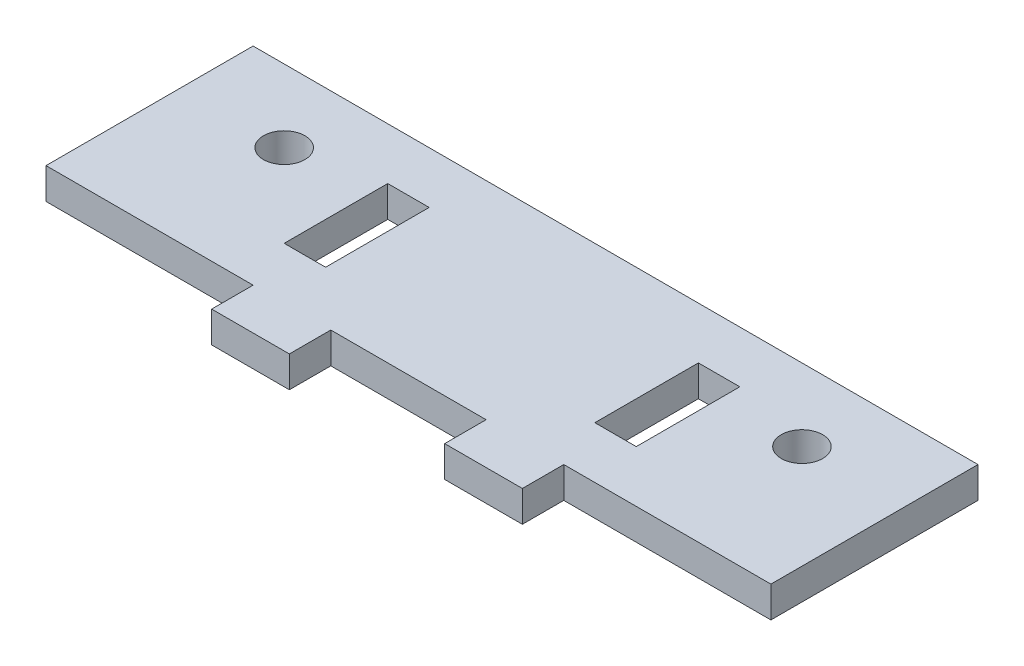
ISO-10303-21;
HEADER;
FILE_DESCRIPTION(('STEP AP214'),'2;1');
FILE_NAME('part.step','',(''),(''),'','','');
FILE_SCHEMA(('AUTOMOTIVE_DESIGN { 1 0 10303 214 1 1 1 1 }'));
ENDSEC;
DATA;
#1=APPLICATION_CONTEXT('core data for automotive mechanical design processes');
#2=APPLICATION_PROTOCOL_DEFINITION('international standard','automotive_design',2000,#1);
#3=PRODUCT_CONTEXT('',#1,'mechanical');
#4=PRODUCT('Part','Part','',(#3));
#5=PRODUCT_RELATED_PRODUCT_CATEGORY('part','',(#4));
#6=PRODUCT_DEFINITION_FORMATION('','',#4);
#7=PRODUCT_DEFINITION_CONTEXT('part definition',#1,'design');
#8=PRODUCT_DEFINITION('design','',#6,#7);
#9=PRODUCT_DEFINITION_SHAPE('','',#8);
#10=(LENGTH_UNIT() NAMED_UNIT(*) SI_UNIT(.MILLI.,.METRE.));
#11=(NAMED_UNIT(*) PLANE_ANGLE_UNIT() SI_UNIT($,.RADIAN.));
#12=(NAMED_UNIT(*) SI_UNIT($,.STERADIAN.) SOLID_ANGLE_UNIT());
#13=UNCERTAINTY_MEASURE_WITH_UNIT(LENGTH_MEASURE(1.E-05),#10,'distance_accuracy_value','');
#14=(GEOMETRIC_REPRESENTATION_CONTEXT(3) GLOBAL_UNCERTAINTY_ASSIGNED_CONTEXT((#13)) GLOBAL_UNIT_ASSIGNED_CONTEXT((#10,
#11,#12)) REPRESENTATION_CONTEXT('',''));
#15=CARTESIAN_POINT('',(0.,0.,0.));
#16=DIRECTION('',(0.,0.,1.));
#17=DIRECTION('',(1.,0.,0.));
#18=AXIS2_PLACEMENT_3D('',#15,#16,#17);
#19=CARTESIAN_POINT('',(0.,3.,0.));
#20=DIRECTION('',(0.,-1.,0.));
#21=DIRECTION('',(0.,0.,-1.));
#22=AXIS2_PLACEMENT_3D('',#19,#20,#21);
#23=PLANE('',#22);
#24=DIRECTION('',(0.,0.,1.));
#25=VECTOR('',#24,1.);
#26=CARTESIAN_POINT('',(18.,3.,-15.));
#27=LINE('',#26,#25);
#28=CARTESIAN_POINT('',(18.,3.,-15.));
#29=VERTEX_POINT('',#28);
#30=CARTESIAN_POINT('',(18.,3.,-5.));
#31=VERTEX_POINT('',#30);
#32=EDGE_CURVE('E234',#29,#31,#27,.T.);
#33=ORIENTED_EDGE('',*,*,#32,.F.);
#34=DIRECTION('',(-1.,0.,0.));
#35=VECTOR('',#34,1.);
#36=CARTESIAN_POINT('',(18.,3.,-15.));
#37=LINE('',#36,#35);
#38=CARTESIAN_POINT('',(22.,3.,-15.));
#39=VERTEX_POINT('',#38);
#40=EDGE_CURVE('E245',#39,#29,#37,.T.);
#41=ORIENTED_EDGE('',*,*,#40,.F.);
#42=DIRECTION('',(0.,0.,-1.));
#43=VECTOR('',#42,1.);
#44=CARTESIAN_POINT('',(22.,3.,-15.));
#45=LINE('',#44,#43);
#46=CARTESIAN_POINT('',(22.,3.,-5.));
#47=VERTEX_POINT('',#46);
#48=EDGE_CURVE('E241',#47,#39,#45,.T.);
#49=ORIENTED_EDGE('',*,*,#48,.F.);
#50=DIRECTION('',(1.,0.,0.));
#51=VECTOR('',#50,1.);
#52=CARTESIAN_POINT('',(18.,3.,-5.));
#53=LINE('',#52,#51);
#54=EDGE_CURVE('E237',#31,#47,#53,.T.);
#55=ORIENTED_EDGE('',*,*,#54,.F.);
#56=EDGE_LOOP('',(#33,#41,#49,#55));
#57=FACE_BOUND('',#56,.T.);
#58=DIRECTION('',(0.,0.,1.));
#59=VECTOR('',#58,1.);
#60=CARTESIAN_POINT('',(0.,3.,0.));
#61=LINE('',#60,#59);
#62=CARTESIAN_POINT('',(0.,3.,-20.));
#63=VERTEX_POINT('',#62);
#64=CARTESIAN_POINT('',(0.,3.,0.));
#65=VERTEX_POINT('',#64);
#66=EDGE_CURVE('E277',#63,#65,#61,.T.);
#67=ORIENTED_EDGE('',*,*,#66,.T.);
#68=DIRECTION('',(1.,0.,0.));
#69=VECTOR('',#68,1.);
#70=CARTESIAN_POINT('',(0.,3.,0.));
#71=LINE('',#70,#69);
#72=CARTESIAN_POINT('',(20.,3.,0.));
#73=VERTEX_POINT('',#72);
#74=EDGE_CURVE('E281',#65,#73,#71,.T.);
#75=ORIENTED_EDGE('',*,*,#74,.T.);
#76=DIRECTION('',(0.,0.,1.));
#77=VECTOR('',#76,1.);
#78=CARTESIAN_POINT('',(20.,3.,0.));
#79=LINE('',#78,#77);
#80=CARTESIAN_POINT('',(20.,3.,4.));
#81=VERTEX_POINT('',#80);
#82=EDGE_CURVE('E285',#73,#81,#79,.T.);
#83=ORIENTED_EDGE('',*,*,#82,.T.);
#84=DIRECTION('',(1.,0.,0.));
#85=VECTOR('',#84,1.);
#86=CARTESIAN_POINT('',(20.,3.,4.));
#87=LINE('',#86,#85);
#88=CARTESIAN_POINT('',(27.5,3.,4.));
#89=VERTEX_POINT('',#88);
#90=EDGE_CURVE('E288',#81,#89,#87,.T.);
#91=ORIENTED_EDGE('',*,*,#90,.T.);
#92=DIRECTION('',(0.,0.,-1.));
#93=VECTOR('',#92,1.);
#94=CARTESIAN_POINT('',(27.5,3.,0.));
#95=LINE('',#94,#93);
#96=CARTESIAN_POINT('',(27.5,3.,0.));
#97=VERTEX_POINT('',#96);
#98=EDGE_CURVE('E291',#89,#97,#95,.T.);
#99=ORIENTED_EDGE('',*,*,#98,.T.);
#100=DIRECTION('',(1.,0.,0.));
#101=VECTOR('',#100,1.);
#102=CARTESIAN_POINT('',(27.5,3.,0.));
#103=LINE('',#102,#101);
#104=CARTESIAN_POINT('',(42.5,3.,0.));
#105=VERTEX_POINT('',#104);
#106=EDGE_CURVE('E294',#97,#105,#103,.T.);
#107=ORIENTED_EDGE('',*,*,#106,.T.);
#108=DIRECTION('',(0.,0.,1.));
#109=VECTOR('',#108,1.);
#110=CARTESIAN_POINT('',(42.5,3.,0.));
#111=LINE('',#110,#109);
#112=CARTESIAN_POINT('',(42.5,3.,4.));
#113=VERTEX_POINT('',#112);
#114=EDGE_CURVE('E297',#105,#113,#111,.T.);
#115=ORIENTED_EDGE('',*,*,#114,.T.);
#116=DIRECTION('',(1.,0.,0.));
#117=VECTOR('',#116,1.);
#118=CARTESIAN_POINT('',(50.,3.,4.));
#119=LINE('',#118,#117);
#120=CARTESIAN_POINT('',(50.,3.,4.));
#121=VERTEX_POINT('',#120);
#122=EDGE_CURVE('E300',#113,#121,#119,.T.);
#123=ORIENTED_EDGE('',*,*,#122,.T.);
#124=DIRECTION('',(0.,0.,-1.));
#125=VECTOR('',#124,1.);
#126=CARTESIAN_POINT('',(50.,3.,0.));
#127=LINE('',#126,#125);
#128=CARTESIAN_POINT('',(50.,3.,0.));
#129=VERTEX_POINT('',#128);
#130=EDGE_CURVE('E303',#121,#129,#127,.T.);
#131=ORIENTED_EDGE('',*,*,#130,.T.);
#132=DIRECTION('',(1.,0.,0.));
#133=VECTOR('',#132,1.);
#134=CARTESIAN_POINT('',(50.,3.,0.));
#135=LINE('',#134,#133);
#136=CARTESIAN_POINT('',(70.,3.,0.));
#137=VERTEX_POINT('',#136);
#138=EDGE_CURVE('E306',#129,#137,#135,.T.);
#139=ORIENTED_EDGE('',*,*,#138,.T.);
#140=DIRECTION('',(0.,0.,-1.));
#141=VECTOR('',#140,1.);
#142=CARTESIAN_POINT('',(70.,3.,0.));
#143=LINE('',#142,#141);
#144=CARTESIAN_POINT('',(70.,3.,-20.));
#145=VERTEX_POINT('',#144);
#146=EDGE_CURVE('E309',#137,#145,#143,.T.);
#147=ORIENTED_EDGE('',*,*,#146,.T.);
#148=DIRECTION('',(-1.,0.,0.));
#149=VECTOR('',#148,1.);
#150=CARTESIAN_POINT('',(0.,3.,-20.));
#151=LINE('',#150,#149);
#152=EDGE_CURVE('E312',#145,#63,#151,.T.);
#153=ORIENTED_EDGE('',*,*,#152,.T.);
#154=EDGE_LOOP('',(#67,#75,#83,#91,#99,#107,#115,#123,#131,#139,#147,#153));
#155=FACE_BOUND('',#154,.T.);
#156=DIRECTION('',(0.,0.,-1.));
#157=VECTOR('',#156,1.);
#158=CARTESIAN_POINT('',(52.,3.,-15.));
#159=LINE('',#158,#157);
#160=CARTESIAN_POINT('',(52.,3.,-5.00000000000001));
#161=VERTEX_POINT('',#160);
#162=CARTESIAN_POINT('',(52.,3.,-15.));
#163=VERTEX_POINT('',#162);
#164=EDGE_CURVE('E183',#161,#163,#159,.T.);
#165=ORIENTED_EDGE('',*,*,#164,.F.);
#166=DIRECTION('',(1.,0.,0.));
#167=VECTOR('',#166,1.);
#168=CARTESIAN_POINT('',(52.,3.,-5.00000000000001));
#169=LINE('',#168,#167);
#170=CARTESIAN_POINT('',(48.,3.,-5.));
#171=VERTEX_POINT('',#170);
#172=EDGE_CURVE('E210',#171,#161,#169,.T.);
#173=ORIENTED_EDGE('',*,*,#172,.F.);
#174=DIRECTION('',(0.,0.,1.));
#175=VECTOR('',#174,1.);
#176=CARTESIAN_POINT('',(48.,3.,-15.));
#177=LINE('',#176,#175);
#178=CARTESIAN_POINT('',(48.,3.,-15.));
#179=VERTEX_POINT('',#178);
#180=EDGE_CURVE('E206',#179,#171,#177,.T.);
#181=ORIENTED_EDGE('',*,*,#180,.F.);
#182=DIRECTION('',(-1.,0.,0.));
#183=VECTOR('',#182,1.);
#184=CARTESIAN_POINT('',(52.,3.,-15.));
#185=LINE('',#184,#183);
#186=EDGE_CURVE('E192',#163,#179,#185,.T.);
#187=ORIENTED_EDGE('',*,*,#186,.F.);
#188=EDGE_LOOP('',(#165,#173,#181,#187));
#189=FACE_BOUND('',#188,.T.);
#190=CARTESIAN_POINT('',(10.,3.,-13.));
#191=DIRECTION('',(0.,1.,0.));
#192=DIRECTION('',(0.,0.,1.));
#193=AXIS2_PLACEMENT_3D('',#190,#191,#192);
#194=CIRCLE('',#193,2.);
#195=CARTESIAN_POINT('',(10.,3.,-11.));
#196=VERTEX_POINT('',#195);
#197=EDGE_CURVE('E218',#196,#196,#194,.T.);
#198=ORIENTED_EDGE('',*,*,#197,.F.);
#199=EDGE_LOOP('',(#198));
#200=FACE_BOUND('',#199,.T.);
#201=CARTESIAN_POINT('',(60.,3.,-13.));
#202=DIRECTION('',(0.,1.,0.));
#203=DIRECTION('',(0.,0.,-1.));
#204=AXIS2_PLACEMENT_3D('',#201,#202,#203);
#205=CIRCLE('',#204,2.);
#206=CARTESIAN_POINT('',(60.,3.,-15.));
#207=VERTEX_POINT('',#206);
#208=EDGE_CURVE('E759',#207,#207,#205,.T.);
#209=ORIENTED_EDGE('',*,*,#208,.F.);
#210=EDGE_LOOP('',(#209));
#211=FACE_BOUND('',#210,.T.);
#212=ADVANCED_FACE('F45',(#57,#155,#189,#200,#211),#23,.F.);
#213=CARTESIAN_POINT('',(0.,0.,0.));
#214=DIRECTION('',(0.,-1.,0.));
#215=DIRECTION('',(0.,0.,-1.));
#216=AXIS2_PLACEMENT_3D('',#213,#214,#215);
#217=PLANE('',#216);
#218=CARTESIAN_POINT('',(10.,0.,-13.));
#219=DIRECTION('',(0.,1.,0.));
#220=DIRECTION('',(0.,0.,1.));
#221=AXIS2_PLACEMENT_3D('',#218,#219,#220);
#222=CIRCLE('',#221,2.);
#223=CARTESIAN_POINT('',(10.,0.,-11.));
#224=VERTEX_POINT('',#223);
#225=EDGE_CURVE('E767',#224,#224,#222,.T.);
#226=ORIENTED_EDGE('',*,*,#225,.T.);
#227=EDGE_LOOP('',(#226));
#228=FACE_BOUND('',#227,.T.);
#229=DIRECTION('',(0.,0.,1.));
#230=VECTOR('',#229,1.);
#231=CARTESIAN_POINT('',(0.,0.,0.));
#232=LINE('',#231,#230);
#233=CARTESIAN_POINT('',(0.,0.,-20.));
#234=VERTEX_POINT('',#233);
#235=CARTESIAN_POINT('',(0.,0.,0.));
#236=VERTEX_POINT('',#235);
#237=EDGE_CURVE('E276',#234,#236,#232,.T.);
#238=ORIENTED_EDGE('',*,*,#237,.F.);
#239=DIRECTION('',(-1.,0.,0.));
#240=VECTOR('',#239,1.);
#241=CARTESIAN_POINT('',(0.,0.,-20.));
#242=LINE('',#241,#240);
#243=CARTESIAN_POINT('',(70.,0.,-20.));
#244=VERTEX_POINT('',#243);
#245=EDGE_CURVE('E282',#244,#234,#242,.T.);
#246=ORIENTED_EDGE('',*,*,#245,.F.);
#247=DIRECTION('',(0.,0.,-1.));
#248=VECTOR('',#247,1.);
#249=CARTESIAN_POINT('',(70.,0.,0.));
#250=LINE('',#249,#248);
#251=CARTESIAN_POINT('',(70.,0.,0.));
#252=VERTEX_POINT('',#251);
#253=EDGE_CURVE('E346',#252,#244,#250,.T.);
#254=ORIENTED_EDGE('',*,*,#253,.F.);
#255=DIRECTION('',(1.,0.,0.));
#256=VECTOR('',#255,1.);
#257=CARTESIAN_POINT('',(50.,0.,0.));
#258=LINE('',#257,#256);
#259=CARTESIAN_POINT('',(50.,0.,0.));
#260=VERTEX_POINT('',#259);
#261=EDGE_CURVE('E343',#260,#252,#258,.T.);
#262=ORIENTED_EDGE('',*,*,#261,.F.);
#263=DIRECTION('',(0.,0.,-1.));
#264=VECTOR('',#263,1.);
#265=CARTESIAN_POINT('',(50.,0.,0.));
#266=LINE('',#265,#264);
#267=CARTESIAN_POINT('',(50.,0.,4.));
#268=VERTEX_POINT('',#267);
#269=EDGE_CURVE('E340',#268,#260,#266,.T.);
#270=ORIENTED_EDGE('',*,*,#269,.F.);
#271=DIRECTION('',(1.,0.,0.));
#272=VECTOR('',#271,1.);
#273=CARTESIAN_POINT('',(50.,0.,4.));
#274=LINE('',#273,#272);
#275=CARTESIAN_POINT('',(42.5,0.,4.));
#276=VERTEX_POINT('',#275);
#277=EDGE_CURVE('E337',#276,#268,#274,.T.);
#278=ORIENTED_EDGE('',*,*,#277,.F.);
#279=DIRECTION('',(0.,0.,1.));
#280=VECTOR('',#279,1.);
#281=CARTESIAN_POINT('',(42.5,0.,0.));
#282=LINE('',#281,#280);
#283=CARTESIAN_POINT('',(42.5,0.,0.));
#284=VERTEX_POINT('',#283);
#285=EDGE_CURVE('E334',#284,#276,#282,.T.);
#286=ORIENTED_EDGE('',*,*,#285,.F.);
#287=DIRECTION('',(1.,0.,0.));
#288=VECTOR('',#287,1.);
#289=CARTESIAN_POINT('',(27.5,0.,0.));
#290=LINE('',#289,#288);
#291=CARTESIAN_POINT('',(27.5,0.,0.));
#292=VERTEX_POINT('',#291);
#293=EDGE_CURVE('E331',#292,#284,#290,.T.);
#294=ORIENTED_EDGE('',*,*,#293,.F.);
#295=DIRECTION('',(0.,0.,-1.));
#296=VECTOR('',#295,1.);
#297=CARTESIAN_POINT('',(27.5,0.,0.));
#298=LINE('',#297,#296);
#299=CARTESIAN_POINT('',(27.5,0.,4.));
#300=VERTEX_POINT('',#299);
#301=EDGE_CURVE('E328',#300,#292,#298,.T.);
#302=ORIENTED_EDGE('',*,*,#301,.F.);
#303=DIRECTION('',(1.,0.,0.));
#304=VECTOR('',#303,1.);
#305=CARTESIAN_POINT('',(20.,0.,4.));
#306=LINE('',#305,#304);
#307=CARTESIAN_POINT('',(20.,0.,4.));
#308=VERTEX_POINT('',#307);
#309=EDGE_CURVE('E325',#308,#300,#306,.T.);
#310=ORIENTED_EDGE('',*,*,#309,.F.);
#311=DIRECTION('',(0.,0.,1.));
#312=VECTOR('',#311,1.);
#313=CARTESIAN_POINT('',(20.,0.,0.));
#314=LINE('',#313,#312);
#315=CARTESIAN_POINT('',(20.,0.,0.));
#316=VERTEX_POINT('',#315);
#317=EDGE_CURVE('E322',#316,#308,#314,.T.);
#318=ORIENTED_EDGE('',*,*,#317,.F.);
#319=DIRECTION('',(1.,0.,0.));
#320=VECTOR('',#319,1.);
#321=CARTESIAN_POINT('',(0.,0.,0.));
#322=LINE('',#321,#320);
#323=EDGE_CURVE('E319',#236,#316,#322,.T.);
#324=ORIENTED_EDGE('',*,*,#323,.F.);
#325=EDGE_LOOP('',(#238,#246,#254,#262,#270,#278,#286,#294,#302,#310,#318,#324));
#326=FACE_BOUND('',#325,.T.);
#327=DIRECTION('',(-1.,0.,0.));
#328=VECTOR('',#327,1.);
#329=CARTESIAN_POINT('',(18.,0.,-15.));
#330=LINE('',#329,#328);
#331=CARTESIAN_POINT('',(22.,0.,-15.));
#332=VERTEX_POINT('',#331);
#333=CARTESIAN_POINT('',(18.,0.,-15.));
#334=VERTEX_POINT('',#333);
#335=EDGE_CURVE('E238',#332,#334,#330,.T.);
#336=ORIENTED_EDGE('',*,*,#335,.T.);
#337=DIRECTION('',(0.,0.,1.));
#338=VECTOR('',#337,1.);
#339=CARTESIAN_POINT('',(18.,0.,-15.));
#340=LINE('',#339,#338);
#341=CARTESIAN_POINT('',(18.,0.,-5.));
#342=VERTEX_POINT('',#341);
#343=EDGE_CURVE('E201',#334,#342,#340,.T.);
#344=ORIENTED_EDGE('',*,*,#343,.T.);
#345=DIRECTION('',(1.,0.,0.));
#346=VECTOR('',#345,1.);
#347=CARTESIAN_POINT('',(18.,0.,-5.));
#348=LINE('',#347,#346);
#349=CARTESIAN_POINT('',(22.,0.,-5.));
#350=VERTEX_POINT('',#349);
#351=EDGE_CURVE('E252',#342,#350,#348,.T.);
#352=ORIENTED_EDGE('',*,*,#351,.T.);
#353=DIRECTION('',(0.,0.,-1.));
#354=VECTOR('',#353,1.);
#355=CARTESIAN_POINT('',(22.,0.,-15.));
#356=LINE('',#355,#354);
#357=EDGE_CURVE('E256',#350,#332,#356,.T.);
#358=ORIENTED_EDGE('',*,*,#357,.T.);
#359=EDGE_LOOP('',(#336,#344,#352,#358));
#360=FACE_BOUND('',#359,.T.);
#361=DIRECTION('',(1.,0.,0.));
#362=VECTOR('',#361,1.);
#363=CARTESIAN_POINT('',(52.,0.,-5.00000000000001));
#364=LINE('',#363,#362);
#365=CARTESIAN_POINT('',(48.,0.,-5.));
#366=VERTEX_POINT('',#365);
#367=CARTESIAN_POINT('',(52.,0.,-5.00000000000001));
#368=VERTEX_POINT('',#367);
#369=EDGE_CURVE('E193',#366,#368,#364,.T.);
#370=ORIENTED_EDGE('',*,*,#369,.T.);
#371=DIRECTION('',(0.,0.,-1.));
#372=VECTOR('',#371,1.);
#373=CARTESIAN_POINT('',(52.,0.,-15.));
#374=LINE('',#373,#372);
#375=CARTESIAN_POINT('',(52.,0.,-15.));
#376=VERTEX_POINT('',#375);
#377=EDGE_CURVE('E69',#368,#376,#374,.T.);
#378=ORIENTED_EDGE('',*,*,#377,.T.);
#379=DIRECTION('',(-1.,0.,0.));
#380=VECTOR('',#379,1.);
#381=CARTESIAN_POINT('',(52.,0.,-15.));
#382=LINE('',#381,#380);
#383=CARTESIAN_POINT('',(48.,0.,-15.));
#384=VERTEX_POINT('',#383);
#385=EDGE_CURVE('E199',#376,#384,#382,.T.);
#386=ORIENTED_EDGE('',*,*,#385,.T.);
#387=DIRECTION('',(0.,0.,1.));
#388=VECTOR('',#387,1.);
#389=CARTESIAN_POINT('',(48.,0.,-15.));
#390=LINE('',#389,#388);
#391=EDGE_CURVE('E221',#384,#366,#390,.T.);
#392=ORIENTED_EDGE('',*,*,#391,.T.);
#393=EDGE_LOOP('',(#370,#378,#386,#392));
#394=FACE_BOUND('',#393,.T.);
#395=CARTESIAN_POINT('',(60.,0.,-13.));
#396=DIRECTION('',(0.,1.,0.));
#397=DIRECTION('',(0.,0.,-1.));
#398=AXIS2_PLACEMENT_3D('',#395,#396,#397);
#399=CIRCLE('',#398,2.);
#400=CARTESIAN_POINT('',(60.,0.,-15.));
#401=VERTEX_POINT('',#400);
#402=EDGE_CURVE('E762',#401,#401,#399,.T.);
#403=ORIENTED_EDGE('',*,*,#402,.T.);
#404=EDGE_LOOP('',(#403));
#405=FACE_BOUND('',#404,.T.);
#406=ADVANCED_FACE('F401',(#228,#326,#360,#394,#405),#217,.T.);
#407=CARTESIAN_POINT('',(0.,3.,0.));
#408=DIRECTION('',(1.,0.,0.));
#409=DIRECTION('',(0.,0.,-1.));
#410=AXIS2_PLACEMENT_3D('',#407,#408,#409);
#411=PLANE('',#410);
#412=ORIENTED_EDGE('',*,*,#237,.T.);
#413=DIRECTION('',(0.,-1.,0.));
#414=VECTOR('',#413,1.);
#415=CARTESIAN_POINT('',(0.,3.,0.));
#416=LINE('',#415,#414);
#417=EDGE_CURVE('E11',#65,#236,#416,.T.);
#418=ORIENTED_EDGE('',*,*,#417,.F.);
#419=ORIENTED_EDGE('',*,*,#66,.F.);
#420=DIRECTION('',(0.,-1.,0.));
#421=VECTOR('',#420,1.);
#422=CARTESIAN_POINT('',(0.,3.,-20.));
#423=LINE('',#422,#421);
#424=EDGE_CURVE('E315',#63,#234,#423,.T.);
#425=ORIENTED_EDGE('',*,*,#424,.T.);
#426=EDGE_LOOP('',(#412,#418,#419,#425));
#427=FACE_BOUND('',#426,.T.);
#428=ADVANCED_FACE('F47',(#427),#411,.F.);
#429=CARTESIAN_POINT('',(0.,3.,0.));
#430=DIRECTION('',(0.,0.,-1.));
#431=DIRECTION('',(-1.,0.,0.));
#432=AXIS2_PLACEMENT_3D('',#429,#430,#431);
#433=PLANE('',#432);
#434=ORIENTED_EDGE('',*,*,#323,.T.);
#435=DIRECTION('',(0.,-1.,0.));
#436=VECTOR('',#435,1.);
#437=CARTESIAN_POINT('',(20.,3.,0.));
#438=LINE('',#437,#436);
#439=EDGE_CURVE('E54',#73,#316,#438,.T.);
#440=ORIENTED_EDGE('',*,*,#439,.F.);
#441=ORIENTED_EDGE('',*,*,#74,.F.);
#442=ORIENTED_EDGE('',*,*,#417,.T.);
#443=EDGE_LOOP('',(#434,#440,#441,#442));
#444=FACE_BOUND('',#443,.T.);
#445=ADVANCED_FACE('F418',(#444),#433,.F.);
#446=CARTESIAN_POINT('',(20.,3.,0.));
#447=DIRECTION('',(1.,0.,0.));
#448=DIRECTION('',(0.,0.,-1.));
#449=AXIS2_PLACEMENT_3D('',#446,#447,#448);
#450=PLANE('',#449);
#451=ORIENTED_EDGE('',*,*,#317,.T.);
#452=DIRECTION('',(0.,-1.,0.));
#453=VECTOR('',#452,1.);
#454=CARTESIAN_POINT('',(20.,3.,4.));
#455=LINE('',#454,#453);
#456=EDGE_CURVE('E386',#81,#308,#455,.T.);
#457=ORIENTED_EDGE('',*,*,#456,.F.);
#458=ORIENTED_EDGE('',*,*,#82,.F.);
#459=ORIENTED_EDGE('',*,*,#439,.T.);
#460=EDGE_LOOP('',(#451,#457,#458,#459));
#461=FACE_BOUND('',#460,.T.);
#462=ADVANCED_FACE('F395',(#461),#450,.F.);
#463=CARTESIAN_POINT('',(20.,3.,4.));
#464=DIRECTION('',(0.,0.,-1.));
#465=DIRECTION('',(-1.,0.,0.));
#466=AXIS2_PLACEMENT_3D('',#463,#464,#465);
#467=PLANE('',#466);
#468=ORIENTED_EDGE('',*,*,#309,.T.);
#469=DIRECTION('',(0.,-1.,0.));
#470=VECTOR('',#469,1.);
#471=CARTESIAN_POINT('',(27.5,3.,4.));
#472=LINE('',#471,#470);
#473=EDGE_CURVE('E382',#89,#300,#472,.T.);
#474=ORIENTED_EDGE('',*,*,#473,.F.);
#475=ORIENTED_EDGE('',*,*,#90,.F.);
#476=ORIENTED_EDGE('',*,*,#456,.T.);
#477=EDGE_LOOP('',(#468,#474,#475,#476));
#478=FACE_BOUND('',#477,.T.);
#479=ADVANCED_FACE('F407',(#478),#467,.F.);
#480=CARTESIAN_POINT('',(27.5,3.,0.));
#481=DIRECTION('',(-1.,0.,0.));
#482=DIRECTION('',(0.,0.,1.));
#483=AXIS2_PLACEMENT_3D('',#480,#481,#482);
#484=PLANE('',#483);
#485=ORIENTED_EDGE('',*,*,#301,.T.);
#486=DIRECTION('',(0.,-1.,0.));
#487=VECTOR('',#486,1.);
#488=CARTESIAN_POINT('',(27.5,3.,0.));
#489=LINE('',#488,#487);
#490=EDGE_CURVE('E378',#97,#292,#489,.T.);
#491=ORIENTED_EDGE('',*,*,#490,.F.);
#492=ORIENTED_EDGE('',*,*,#98,.F.);
#493=ORIENTED_EDGE('',*,*,#473,.T.);
#494=EDGE_LOOP('',(#485,#491,#492,#493));
#495=FACE_BOUND('',#494,.T.);
#496=ADVANCED_FACE('F411',(#495),#484,.F.);
#497=CARTESIAN_POINT('',(27.5,3.,0.));
#498=DIRECTION('',(0.,0.,-1.));
#499=DIRECTION('',(-1.,0.,0.));
#500=AXIS2_PLACEMENT_3D('',#497,#498,#499);
#501=PLANE('',#500);
#502=ORIENTED_EDGE('',*,*,#293,.T.);
#503=DIRECTION('',(0.,-1.,0.));
#504=VECTOR('',#503,1.);
#505=CARTESIAN_POINT('',(42.5,3.,0.));
#506=LINE('',#505,#504);
#507=EDGE_CURVE('E374',#105,#284,#506,.T.);
#508=ORIENTED_EDGE('',*,*,#507,.F.);
#509=ORIENTED_EDGE('',*,*,#106,.F.);
#510=ORIENTED_EDGE('',*,*,#490,.T.);
#511=EDGE_LOOP('',(#502,#508,#509,#510));
#512=FACE_BOUND('',#511,.T.);
#513=ADVANCED_FACE('F451',(#512),#501,.F.);
#514=CARTESIAN_POINT('',(42.5,3.,0.));
#515=DIRECTION('',(1.,0.,0.));
#516=DIRECTION('',(0.,0.,-1.));
#517=AXIS2_PLACEMENT_3D('',#514,#515,#516);
#518=PLANE('',#517);
#519=ORIENTED_EDGE('',*,*,#285,.T.);
#520=DIRECTION('',(0.,-1.,0.));
#521=VECTOR('',#520,1.);
#522=CARTESIAN_POINT('',(42.5,3.,4.));
#523=LINE('',#522,#521);
#524=EDGE_CURVE('E370',#113,#276,#523,.T.);
#525=ORIENTED_EDGE('',*,*,#524,.F.);
#526=ORIENTED_EDGE('',*,*,#114,.F.);
#527=ORIENTED_EDGE('',*,*,#507,.T.);
#528=EDGE_LOOP('',(#519,#525,#526,#527));
#529=FACE_BOUND('',#528,.T.);
#530=ADVANCED_FACE('F449',(#529),#518,.F.);
#531=CARTESIAN_POINT('',(50.,3.,4.));
#532=DIRECTION('',(0.,0.,-1.));
#533=DIRECTION('',(-1.,0.,0.));
#534=AXIS2_PLACEMENT_3D('',#531,#532,#533);
#535=PLANE('',#534);
#536=ORIENTED_EDGE('',*,*,#277,.T.);
#537=DIRECTION('',(0.,-1.,0.));
#538=VECTOR('',#537,1.);
#539=CARTESIAN_POINT('',(50.,3.,4.));
#540=LINE('',#539,#538);
#541=EDGE_CURVE('E366',#121,#268,#540,.T.);
#542=ORIENTED_EDGE('',*,*,#541,.F.);
#543=ORIENTED_EDGE('',*,*,#122,.F.);
#544=ORIENTED_EDGE('',*,*,#524,.T.);
#545=EDGE_LOOP('',(#536,#542,#543,#544));
#546=FACE_BOUND('',#545,.T.);
#547=ADVANCED_FACE('F445',(#546),#535,.F.);
#548=CARTESIAN_POINT('',(50.,3.,0.));
#549=DIRECTION('',(-1.,0.,0.));
#550=DIRECTION('',(0.,0.,1.));
#551=AXIS2_PLACEMENT_3D('',#548,#549,#550);
#552=PLANE('',#551);
#553=ORIENTED_EDGE('',*,*,#269,.T.);
#554=DIRECTION('',(0.,-1.,0.));
#555=VECTOR('',#554,1.);
#556=CARTESIAN_POINT('',(50.,3.,0.));
#557=LINE('',#556,#555);
#558=EDGE_CURVE('E362',#129,#260,#557,.T.);
#559=ORIENTED_EDGE('',*,*,#558,.F.);
#560=ORIENTED_EDGE('',*,*,#130,.F.);
#561=ORIENTED_EDGE('',*,*,#541,.T.);
#562=EDGE_LOOP('',(#553,#559,#560,#561));
#563=FACE_BOUND('',#562,.T.);
#564=ADVANCED_FACE('F440',(#563),#552,.F.);
#565=CARTESIAN_POINT('',(50.,3.,0.));
#566=DIRECTION('',(0.,0.,-1.));
#567=DIRECTION('',(-1.,0.,0.));
#568=AXIS2_PLACEMENT_3D('',#565,#566,#567);
#569=PLANE('',#568);
#570=ORIENTED_EDGE('',*,*,#261,.T.);
#571=DIRECTION('',(0.,-1.,0.));
#572=VECTOR('',#571,1.);
#573=CARTESIAN_POINT('',(70.,3.,0.));
#574=LINE('',#573,#572);
#575=EDGE_CURVE('E358',#137,#252,#574,.T.);
#576=ORIENTED_EDGE('',*,*,#575,.F.);
#577=ORIENTED_EDGE('',*,*,#138,.F.);
#578=ORIENTED_EDGE('',*,*,#558,.T.);
#579=EDGE_LOOP('',(#570,#576,#577,#578));
#580=FACE_BOUND('',#579,.T.);
#581=ADVANCED_FACE('F434',(#580),#569,.F.);
#582=CARTESIAN_POINT('',(70.,3.,0.));
#583=DIRECTION('',(-1.,0.,0.));
#584=DIRECTION('',(0.,0.,1.));
#585=AXIS2_PLACEMENT_3D('',#582,#583,#584);
#586=PLANE('',#585);
#587=ORIENTED_EDGE('',*,*,#253,.T.);
#588=DIRECTION('',(0.,-1.,0.));
#589=VECTOR('',#588,1.);
#590=CARTESIAN_POINT('',(70.,3.,-20.));
#591=LINE('',#590,#589);
#592=EDGE_CURVE('E354',#145,#244,#591,.T.);
#593=ORIENTED_EDGE('',*,*,#592,.F.);
#594=ORIENTED_EDGE('',*,*,#146,.F.);
#595=ORIENTED_EDGE('',*,*,#575,.T.);
#596=EDGE_LOOP('',(#587,#593,#594,#595));
#597=FACE_BOUND('',#596,.T.);
#598=ADVANCED_FACE('F430',(#597),#586,.F.);
#599=CARTESIAN_POINT('',(0.,3.,-20.));
#600=DIRECTION('',(0.,0.,1.));
#601=DIRECTION('',(1.,0.,0.));
#602=AXIS2_PLACEMENT_3D('',#599,#600,#601);
#603=PLANE('',#602);
#604=ORIENTED_EDGE('',*,*,#245,.T.);
#605=ORIENTED_EDGE('',*,*,#424,.F.);
#606=ORIENTED_EDGE('',*,*,#152,.F.);
#607=ORIENTED_EDGE('',*,*,#592,.T.);
#608=EDGE_LOOP('',(#604,#605,#606,#607));
#609=FACE_BOUND('',#608,.T.);
#610=ADVANCED_FACE('F425',(#609),#603,.F.);
#611=CARTESIAN_POINT('',(18.,3.,-15.));
#612=DIRECTION('',(1.,0.,0.));
#613=DIRECTION('',(0.,0.,-1.));
#614=AXIS2_PLACEMENT_3D('',#611,#612,#613);
#615=PLANE('',#614);
#616=ORIENTED_EDGE('',*,*,#343,.F.);
#617=DIRECTION('',(0.,-1.,0.));
#618=VECTOR('',#617,1.);
#619=CARTESIAN_POINT('',(18.,3.,-15.));
#620=LINE('',#619,#618);
#621=EDGE_CURVE('E248',#29,#334,#620,.T.);
#622=ORIENTED_EDGE('',*,*,#621,.F.);
#623=ORIENTED_EDGE('',*,*,#32,.T.);
#624=DIRECTION('',(0.,-1.,0.));
#625=VECTOR('',#624,1.);
#626=CARTESIAN_POINT('',(18.,3.,-5.));
#627=LINE('',#626,#625);
#628=EDGE_CURVE('E272',#31,#342,#627,.T.);
#629=ORIENTED_EDGE('',*,*,#628,.T.);
#630=EDGE_LOOP('',(#616,#622,#623,#629));
#631=FACE_BOUND('',#630,.T.);
#632=ADVANCED_FACE('F470',(#631),#615,.T.);
#633=CARTESIAN_POINT('',(18.,3.,-5.));
#634=DIRECTION('',(0.,0.,-1.));
#635=DIRECTION('',(-1.,0.,0.));
#636=AXIS2_PLACEMENT_3D('',#633,#634,#635);
#637=PLANE('',#636);
#638=ORIENTED_EDGE('',*,*,#351,.F.);
#639=ORIENTED_EDGE('',*,*,#628,.F.);
#640=ORIENTED_EDGE('',*,*,#54,.T.);
#641=DIRECTION('',(0.,-1.,0.));
#642=VECTOR('',#641,1.);
#643=CARTESIAN_POINT('',(22.,3.,-5.));
#644=LINE('',#643,#642);
#645=EDGE_CURVE('E269',#47,#350,#644,.T.);
#646=ORIENTED_EDGE('',*,*,#645,.T.);
#647=EDGE_LOOP('',(#638,#639,#640,#646));
#648=FACE_BOUND('',#647,.T.);
#649=ADVANCED_FACE('F508',(#648),#637,.T.);
#650=CARTESIAN_POINT('',(22.,3.,-15.));
#651=DIRECTION('',(-1.,0.,0.));
#652=DIRECTION('',(0.,0.,1.));
#653=AXIS2_PLACEMENT_3D('',#650,#651,#652);
#654=PLANE('',#653);
#655=ORIENTED_EDGE('',*,*,#357,.F.);
#656=ORIENTED_EDGE('',*,*,#645,.F.);
#657=ORIENTED_EDGE('',*,*,#48,.T.);
#658=DIRECTION('',(0.,-1.,0.));
#659=VECTOR('',#658,1.);
#660=CARTESIAN_POINT('',(22.,3.,-15.));
#661=LINE('',#660,#659);
#662=EDGE_CURVE('E266',#39,#332,#661,.T.);
#663=ORIENTED_EDGE('',*,*,#662,.T.);
#664=EDGE_LOOP('',(#655,#656,#657,#663));
#665=FACE_BOUND('',#664,.T.);
#666=ADVANCED_FACE('F515',(#665),#654,.T.);
#667=CARTESIAN_POINT('',(18.,3.,-15.));
#668=DIRECTION('',(0.,0.,1.));
#669=DIRECTION('',(1.,0.,0.));
#670=AXIS2_PLACEMENT_3D('',#667,#668,#669);
#671=PLANE('',#670);
#672=ORIENTED_EDGE('',*,*,#335,.F.);
#673=ORIENTED_EDGE('',*,*,#662,.F.);
#674=ORIENTED_EDGE('',*,*,#40,.T.);
#675=ORIENTED_EDGE('',*,*,#621,.T.);
#676=EDGE_LOOP('',(#672,#673,#674,#675));
#677=FACE_BOUND('',#676,.T.);
#678=ADVANCED_FACE('F522',(#677),#671,.T.);
#679=CARTESIAN_POINT('',(52.,3.,-15.));
#680=DIRECTION('',(-1.,0.,0.));
#681=DIRECTION('',(0.,0.,1.));
#682=AXIS2_PLACEMENT_3D('',#679,#680,#681);
#683=PLANE('',#682);
#684=ORIENTED_EDGE('',*,*,#377,.F.);
#685=DIRECTION('',(0.,-1.,0.));
#686=VECTOR('',#685,1.);
#687=CARTESIAN_POINT('',(52.,3.,-5.00000000000001));
#688=LINE('',#687,#686);
#689=EDGE_CURVE('E187',#161,#368,#688,.T.);
#690=ORIENTED_EDGE('',*,*,#689,.F.);
#691=ORIENTED_EDGE('',*,*,#164,.T.);
#692=DIRECTION('',(0.,-1.,0.));
#693=VECTOR('',#692,1.);
#694=CARTESIAN_POINT('',(52.,3.,-15.));
#695=LINE('',#694,#693);
#696=EDGE_CURVE('E186',#163,#376,#695,.T.);
#697=ORIENTED_EDGE('',*,*,#696,.T.);
#698=EDGE_LOOP('',(#684,#690,#691,#697));
#699=FACE_BOUND('',#698,.T.);
#700=ADVANCED_FACE('F185',(#699),#683,.T.);
#701=CARTESIAN_POINT('',(52.,3.,-15.));
#702=DIRECTION('',(0.,0.,1.));
#703=DIRECTION('',(1.,0.,0.));
#704=AXIS2_PLACEMENT_3D('',#701,#702,#703);
#705=PLANE('',#704);
#706=ORIENTED_EDGE('',*,*,#385,.F.);
#707=ORIENTED_EDGE('',*,*,#696,.F.);
#708=ORIENTED_EDGE('',*,*,#186,.T.);
#709=DIRECTION('',(0.,-1.,0.));
#710=VECTOR('',#709,1.);
#711=CARTESIAN_POINT('',(48.,3.,-15.));
#712=LINE('',#711,#710);
#713=EDGE_CURVE('E202',#179,#384,#712,.T.);
#714=ORIENTED_EDGE('',*,*,#713,.T.);
#715=EDGE_LOOP('',(#706,#707,#708,#714));
#716=FACE_BOUND('',#715,.T.);
#717=ADVANCED_FACE('F196',(#716),#705,.T.);
#718=CARTESIAN_POINT('',(48.,3.,-15.));
#719=DIRECTION('',(1.,0.,0.));
#720=DIRECTION('',(0.,0.,-1.));
#721=AXIS2_PLACEMENT_3D('',#718,#719,#720);
#722=PLANE('',#721);
#723=ORIENTED_EDGE('',*,*,#391,.F.);
#724=ORIENTED_EDGE('',*,*,#713,.F.);
#725=ORIENTED_EDGE('',*,*,#180,.T.);
#726=DIRECTION('',(0.,-1.,0.));
#727=VECTOR('',#726,1.);
#728=CARTESIAN_POINT('',(48.,3.,-5.));
#729=LINE('',#728,#727);
#730=EDGE_CURVE('E61',#171,#366,#729,.T.);
#731=ORIENTED_EDGE('',*,*,#730,.T.);
#732=EDGE_LOOP('',(#723,#724,#725,#731));
#733=FACE_BOUND('',#732,.T.);
#734=ADVANCED_FACE('F543',(#733),#722,.T.);
#735=CARTESIAN_POINT('',(52.,3.,-5.00000000000001));
#736=DIRECTION('',(0.,0.,-1.));
#737=DIRECTION('',(-1.,0.,0.));
#738=AXIS2_PLACEMENT_3D('',#735,#736,#737);
#739=PLANE('',#738);
#740=ORIENTED_EDGE('',*,*,#369,.F.);
#741=ORIENTED_EDGE('',*,*,#730,.F.);
#742=ORIENTED_EDGE('',*,*,#172,.T.);
#743=ORIENTED_EDGE('',*,*,#689,.T.);
#744=EDGE_LOOP('',(#740,#741,#742,#743));
#745=FACE_BOUND('',#744,.T.);
#746=ADVANCED_FACE('F550',(#745),#739,.T.);
#747=CARTESIAN_POINT('',(10.,3.,-13.));
#748=DIRECTION('',(0.,-1.,0.));
#749=DIRECTION('',(0.,0.,-1.));
#750=AXIS2_PLACEMENT_3D('',#747,#748,#749);
#751=CYLINDRICAL_SURFACE('',#750,2.);
#752=ORIENTED_EDGE('',*,*,#197,.T.);
#753=EDGE_LOOP('',(#752));
#754=FACE_BOUND('',#753,.T.);
#755=ORIENTED_EDGE('',*,*,#225,.F.);
#756=EDGE_LOOP('',(#755));
#757=FACE_BOUND('',#756,.T.);
#758=ADVANCED_FACE('F558',(#754,#757),#751,.F.);
#759=CARTESIAN_POINT('',(60.,3.,-13.));
#760=DIRECTION('',(0.,-1.,0.));
#761=DIRECTION('',(0.,0.,-1.));
#762=AXIS2_PLACEMENT_3D('',#759,#760,#761);
#763=CYLINDRICAL_SURFACE('',#762,2.);
#764=ORIENTED_EDGE('',*,*,#208,.T.);
#765=EDGE_LOOP('',(#764));
#766=FACE_BOUND('',#765,.T.);
#767=ORIENTED_EDGE('',*,*,#402,.F.);
#768=EDGE_LOOP('',(#767));
#769=FACE_BOUND('',#768,.T.);
#770=ADVANCED_FACE('F565',(#766,#769),#763,.F.);
#771=CLOSED_SHELL('',(#212,#406,#428,#445,#462,#479,#496,#513,#530,#547,#564,#581,#598,#610,
#632,#649,#666,#678,#700,#717,#734,#746,#758,#770));
#772=MANIFOLD_SOLID_BREP('B2',#771);
#773=ADVANCED_BREP_SHAPE_REPRESENTATION('',(#18,#772),#14);
#774=SHAPE_DEFINITION_REPRESENTATION(#9,#773);
ENDSEC;
END-ISO-10303-21;
